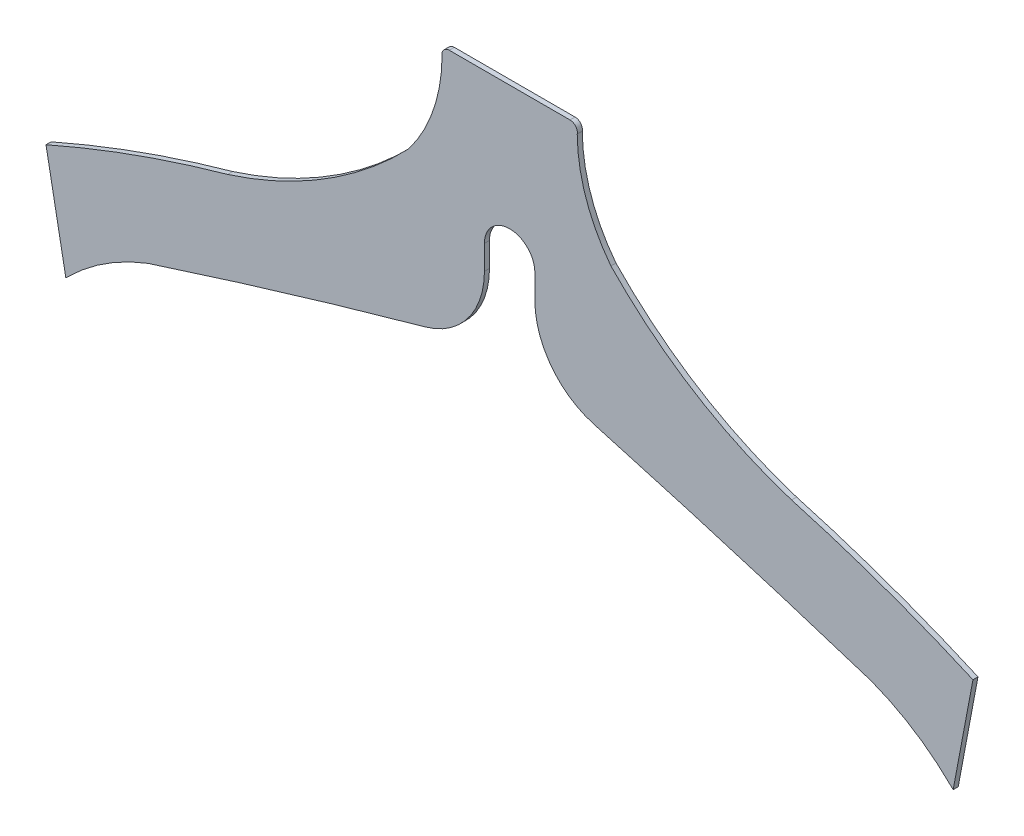
ISO-10303-21;
HEADER;
FILE_DESCRIPTION(('STEP AP214'),'2;1');
FILE_NAME('part.step','',(''),(''),'','','');
FILE_SCHEMA(('AUTOMOTIVE_DESIGN { 1 0 10303 214 1 1 1 1 }'));
ENDSEC;
DATA;
#1=APPLICATION_CONTEXT('core data for automotive mechanical design processes');
#2=APPLICATION_PROTOCOL_DEFINITION('international standard','automotive_design',2000,#1);
#3=PRODUCT_CONTEXT('',#1,'mechanical');
#4=PRODUCT('Part','Part','',(#3));
#5=PRODUCT_RELATED_PRODUCT_CATEGORY('part','',(#4));
#6=PRODUCT_DEFINITION_FORMATION('','',#4);
#7=PRODUCT_DEFINITION_CONTEXT('part definition',#1,'design');
#8=PRODUCT_DEFINITION('design','',#6,#7);
#9=PRODUCT_DEFINITION_SHAPE('','',#8);
#10=(LENGTH_UNIT() NAMED_UNIT(*) SI_UNIT(.MILLI.,.METRE.));
#11=(NAMED_UNIT(*) PLANE_ANGLE_UNIT() SI_UNIT($,.RADIAN.));
#12=(NAMED_UNIT(*) SI_UNIT($,.STERADIAN.) SOLID_ANGLE_UNIT());
#13=UNCERTAINTY_MEASURE_WITH_UNIT(LENGTH_MEASURE(1.E-05),#10,'distance_accuracy_value','');
#14=(GEOMETRIC_REPRESENTATION_CONTEXT(3) GLOBAL_UNCERTAINTY_ASSIGNED_CONTEXT((#13)) GLOBAL_UNIT_ASSIGNED_CONTEXT((#10,
#11,#12)) REPRESENTATION_CONTEXT('',''));
#15=CARTESIAN_POINT('',(0.,0.,0.));
#16=DIRECTION('',(0.,0.,1.));
#17=DIRECTION('',(1.,0.,0.));
#18=AXIS2_PLACEMENT_3D('',#15,#16,#17);
#19=CARTESIAN_POINT('',(-595.807272279208,616.910417452215,0.));
#20=DIRECTION('',(-0.982734564613668,-0.185021013708129,0.));
#21=DIRECTION('',(0.185021013708129,-0.982734564613668,0.));
#22=AXIS2_PLACEMENT_3D('',#19,#20,#21);
#23=PLANE('',#22);
#24=DIRECTION('',(0.185021013708129,-0.982734564613668,0.));
#25=VECTOR('',#24,1.);
#26=CARTESIAN_POINT('',(-168.673710483779,-1651.7989927399,0.));
#27=LINE('',#26,#25);
#28=CARTESIAN_POINT('',(-583.843519435553,553.365238413787,0.));
#29=VERTEX_POINT('',#28);
#30=CARTESIAN_POINT('',(-558.885959893304,420.803774615612,0.));
#31=VERTEX_POINT('',#30);
#32=EDGE_CURVE('E47',#29,#31,#27,.T.);
#33=ORIENTED_EDGE('',*,*,#32,.T.);
#34=DIRECTION('',(0.,0.,-1.));
#35=VECTOR('',#34,1.);
#36=CARTESIAN_POINT('',(-558.885959893304,420.803774615612,6.35));
#37=LINE('',#36,#35);
#38=CARTESIAN_POINT('',(-558.885959893304,420.803774615612,6.35));
#39=VERTEX_POINT('',#38);
#40=EDGE_CURVE('E42',#31,#39,#37,.F.);
#41=ORIENTED_EDGE('',*,*,#40,.T.);
#42=DIRECTION('',(0.185021013708129,-0.982734564613668,0.));
#43=VECTOR('',#42,1.);
#44=CARTESIAN_POINT('',(-168.673710483779,-1651.7989927399,6.35));
#45=LINE('',#44,#43);
#46=CARTESIAN_POINT('',(-583.843519435553,553.365238413787,6.35));
#47=VERTEX_POINT('',#46);
#48=EDGE_CURVE('E352',#47,#39,#45,.T.);
#49=ORIENTED_EDGE('',*,*,#48,.F.);
#50=DIRECTION('',(0.,0.,-1.));
#51=VECTOR('',#50,1.);
#52=CARTESIAN_POINT('',(-583.843519435553,553.365238413787,6.35));
#53=LINE('',#52,#51);
#54=EDGE_CURVE('E349',#47,#29,#53,.T.);
#55=ORIENTED_EDGE('',*,*,#54,.T.);
#56=EDGE_LOOP('',(#33,#41,#49,#55));
#57=FACE_BOUND('',#56,.T.);
#58=ADVANCED_FACE('F38',(#57),#23,.T.);
#59=CARTESIAN_POINT('',(595.807272279208,616.910417452215,0.));
#60=DIRECTION('',(0.982734564613668,-0.185021013708129,0.));
#61=DIRECTION('',(-0.185021013708129,-0.982734564613668,0.));
#62=AXIS2_PLACEMENT_3D('',#59,#60,#61);
#63=PLANE('',#62);
#64=DIRECTION('',(0.185021013708129,0.982734564613668,0.));
#65=VECTOR('',#64,1.);
#66=CARTESIAN_POINT('',(158.629030851378,-1705.15106160708,6.35));
#67=LINE('',#66,#65);
#68=CARTESIAN_POINT('',(558.949095192104,421.139116202677,6.35));
#69=VERTEX_POINT('',#68);
#70=CARTESIAN_POINT('',(583.87829464678,553.549946093092,6.35));
#71=VERTEX_POINT('',#70);
#72=EDGE_CURVE('E200',#69,#71,#67,.T.);
#73=ORIENTED_EDGE('',*,*,#72,.F.);
#74=DIRECTION('',(0.,0.,-1.));
#75=VECTOR('',#74,1.);
#76=CARTESIAN_POINT('',(558.949095192104,421.139116202677,6.35));
#77=LINE('',#76,#75);
#78=CARTESIAN_POINT('',(558.949095192104,421.139116202677,0.));
#79=VERTEX_POINT('',#78);
#80=EDGE_CURVE('E357',#69,#79,#77,.T.);
#81=ORIENTED_EDGE('',*,*,#80,.T.);
#82=DIRECTION('',(0.185021013708129,0.982734564613668,0.));
#83=VECTOR('',#82,1.);
#84=CARTESIAN_POINT('',(158.629030851378,-1705.15106160708,0.));
#85=LINE('',#84,#83);
#86=CARTESIAN_POINT('',(583.87829464678,553.549946093092,0.));
#87=VERTEX_POINT('',#86);
#88=EDGE_CURVE('E11',#79,#87,#85,.T.);
#89=ORIENTED_EDGE('',*,*,#88,.T.);
#90=DIRECTION('',(0.,0.,-1.));
#91=VECTOR('',#90,1.);
#92=CARTESIAN_POINT('',(583.87829464678,553.549946093092,6.35));
#93=LINE('',#92,#91);
#94=EDGE_CURVE('E355',#87,#71,#93,.F.);
#95=ORIENTED_EDGE('',*,*,#94,.T.);
#96=EDGE_LOOP('',(#73,#81,#89,#95));
#97=FACE_BOUND('',#96,.T.);
#98=ADVANCED_FACE('F40',(#97),#63,.T.);
#99=CARTESIAN_POINT('',(-591.806701857498,459.493110976643,6.35));
#100=DIRECTION('',(0.,0.,-1.));
#101=DIRECTION('',(-1.,0.,0.));
#102=AXIS2_PLACEMENT_3D('',#99,#100,#101);
#103=CYLINDRICAL_SURFACE('',#102,50.7999999953742);
#104=ORIENTED_EDGE('',*,*,#40,.F.);
#105=CARTESIAN_POINT('',(-591.806701857498,459.493110976643,0.));
#106=DIRECTION('',(0.,0.,1.));
#107=DIRECTION('',(1.,0.,0.));
#108=AXIS2_PLACEMENT_3D('',#105,#106,#107);
#109=CIRCLE('',#108,50.7999999953742);
#110=CARTESIAN_POINT('',(-556.074212638233,423.384535627771,0.));
#111=VERTEX_POINT('',#110);
#112=EDGE_CURVE('E282',#31,#111,#109,.T.);
#113=ORIENTED_EDGE('',*,*,#112,.T.);
#114=DIRECTION('',(0.,0.,-1.));
#115=VECTOR('',#114,1.);
#116=CARTESIAN_POINT('',(-556.074212638233,423.384535627771,6.35));
#117=LINE('',#116,#115);
#118=CARTESIAN_POINT('',(-556.074212638233,423.384535627771,6.35));
#119=VERTEX_POINT('',#118);
#120=EDGE_CURVE('E330',#119,#111,#117,.T.);
#121=ORIENTED_EDGE('',*,*,#120,.F.);
#122=CARTESIAN_POINT('',(-591.806701857498,459.493110976643,6.35));
#123=DIRECTION('',(0.,0.,1.));
#124=DIRECTION('',(1.,0.,0.));
#125=AXIS2_PLACEMENT_3D('',#122,#123,#124);
#126=CIRCLE('',#125,50.7999999953742);
#127=EDGE_CURVE('E232',#39,#119,#126,.T.);
#128=ORIENTED_EDGE('',*,*,#127,.F.);
#129=EDGE_LOOP('',(#104,#113,#121,#128));
#130=FACE_BOUND('',#129,.T.);
#131=ADVANCED_FACE('F370',(#130),#103,.T.);
#132=CARTESIAN_POINT('',(-352.772079201171,217.942637673702,6.35));
#133=DIRECTION('',(0.,0.,-1.));
#134=DIRECTION('',(-1.,0.,0.));
#135=AXIS2_PLACEMENT_3D('',#132,#133,#134);
#136=CYLINDRICAL_SURFACE('',#135,289.029636707088);
#137=CARTESIAN_POINT('',(-352.772079201171,217.942637673702,0.));
#138=DIRECTION('',(0.,0.,1.));
#139=DIRECTION('',(1.,0.,0.));
#140=AXIS2_PLACEMENT_3D('',#137,#138,#139);
#141=CIRCLE('',#140,289.029636707088);
#142=CARTESIAN_POINT('',(-455.131011212075,488.240214304752,0.));
#143=VERTEX_POINT('',#142);
#144=EDGE_CURVE('E284',#143,#111,#141,.T.);
#145=ORIENTED_EDGE('',*,*,#144,.F.);
#146=DIRECTION('',(0.,0.,-1.));
#147=VECTOR('',#146,1.);
#148=CARTESIAN_POINT('',(-455.131011212075,488.240214304752,6.35));
#149=LINE('',#148,#147);
#150=CARTESIAN_POINT('',(-455.131011212075,488.240214304752,6.35));
#151=VERTEX_POINT('',#150);
#152=EDGE_CURVE('E328',#151,#143,#149,.T.);
#153=ORIENTED_EDGE('',*,*,#152,.F.);
#154=CARTESIAN_POINT('',(-352.772079201171,217.942637673702,6.35));
#155=DIRECTION('',(0.,0.,1.));
#156=DIRECTION('',(1.,0.,0.));
#157=AXIS2_PLACEMENT_3D('',#154,#155,#156);
#158=CIRCLE('',#157,289.029636707088);
#159=EDGE_CURVE('E234',#151,#119,#158,.T.);
#160=ORIENTED_EDGE('',*,*,#159,.T.);
#161=ORIENTED_EDGE('',*,*,#120,.T.);
#162=EDGE_LOOP('',(#145,#153,#160,#161));
#163=FACE_BOUND('',#162,.T.);
#164=ADVANCED_FACE('F413',(#163),#136,.F.);
#165=CARTESIAN_POINT('',(2211.66508660862,-7725.16942473213,6.35));
#166=DIRECTION('',(0.,0.,-1.));
#167=DIRECTION('',(-1.,0.,0.));
#168=AXIS2_PLACEMENT_3D('',#165,#166,#167);
#169=CYLINDRICAL_SURFACE('',#168,8635.50226251928);
#170=CARTESIAN_POINT('',(2211.66508660862,-7725.16942473213,0.));
#171=DIRECTION('',(0.,0.,1.));
#172=DIRECTION('',(1.,0.,0.));
#173=AXIS2_PLACEMENT_3D('',#170,#171,#172);
#174=CIRCLE('',#173,8635.50226251928);
#175=CARTESIAN_POINT('',(-105.856855128073,593.543899787754,0.));
#176=VERTEX_POINT('',#175);
#177=EDGE_CURVE('E287',#176,#143,#174,.T.);
#178=ORIENTED_EDGE('',*,*,#177,.F.);
#179=DIRECTION('',(0.,0.,-1.));
#180=VECTOR('',#179,1.);
#181=CARTESIAN_POINT('',(-105.856855128073,593.543899787754,6.35));
#182=LINE('',#181,#180);
#183=CARTESIAN_POINT('',(-105.856855128073,593.543899787754,6.35));
#184=VERTEX_POINT('',#183);
#185=EDGE_CURVE('E326',#184,#176,#182,.T.);
#186=ORIENTED_EDGE('',*,*,#185,.F.);
#187=CARTESIAN_POINT('',(2211.66508660862,-7725.16942473213,6.35));
#188=DIRECTION('',(0.,0.,1.));
#189=DIRECTION('',(1.,0.,0.));
#190=AXIS2_PLACEMENT_3D('',#187,#188,#189);
#191=CIRCLE('',#190,8635.50226251928);
#192=EDGE_CURVE('E237',#184,#151,#191,.T.);
#193=ORIENTED_EDGE('',*,*,#192,.T.);
#194=ORIENTED_EDGE('',*,*,#152,.T.);
#195=EDGE_LOOP('',(#178,#186,#193,#194));
#196=FACE_BOUND('',#195,.T.);
#197=ADVANCED_FACE('F449',(#196),#169,.F.);
#198=CARTESIAN_POINT('',(-133.123390666307,691.416756289343,6.35));
#199=DIRECTION('',(0.,0.,-1.));
#200=DIRECTION('',(-1.,0.,0.));
#201=AXIS2_PLACEMENT_3D('',#198,#199,#200);
#202=CYLINDRICAL_SURFACE('',#201,101.600000000191);
#203=CARTESIAN_POINT('',(-133.123390666307,691.416756289343,0.));
#204=DIRECTION('',(0.,0.,1.));
#205=DIRECTION('',(1.,0.,0.));
#206=AXIS2_PLACEMENT_3D('',#203,#204,#205);
#207=CIRCLE('',#206,101.600000000191);
#208=CARTESIAN_POINT('',(-31.5233906661163,691.416756289345,0.));
#209=VERTEX_POINT('',#208);
#210=EDGE_CURVE('E290',#176,#209,#207,.T.);
#211=ORIENTED_EDGE('',*,*,#210,.T.);
#212=DIRECTION('',(0.,0.,-1.));
#213=VECTOR('',#212,1.);
#214=CARTESIAN_POINT('',(-31.5233906661163,691.416756289345,6.35));
#215=LINE('',#214,#213);
#216=CARTESIAN_POINT('',(-31.5233906661163,691.416756289345,6.35));
#217=VERTEX_POINT('',#216);
#218=EDGE_CURVE('E324',#217,#209,#215,.T.);
#219=ORIENTED_EDGE('',*,*,#218,.F.);
#220=CARTESIAN_POINT('',(-133.123390666307,691.416756289343,6.35));
#221=DIRECTION('',(0.,0.,1.));
#222=DIRECTION('',(1.,0.,0.));
#223=AXIS2_PLACEMENT_3D('',#220,#221,#222);
#224=CIRCLE('',#223,101.600000000191);
#225=EDGE_CURVE('E240',#184,#217,#224,.T.);
#226=ORIENTED_EDGE('',*,*,#225,.F.);
#227=ORIENTED_EDGE('',*,*,#185,.T.);
#228=EDGE_LOOP('',(#211,#219,#226,#227));
#229=FACE_BOUND('',#228,.T.);
#230=ADVANCED_FACE('F457',(#229),#202,.T.);
#231=CARTESIAN_POINT('',(-31.5233906661503,-1647.66412096756,6.35));
#232=DIRECTION('',(1.,0.,0.));
#233=DIRECTION('',(0.,1.,0.));
#234=AXIS2_PLACEMENT_3D('',#231,#232,#233);
#235=PLANE('',#234);
#236=DIRECTION('',(0.,-1.,0.));
#237=VECTOR('',#236,1.);
#238=CARTESIAN_POINT('',(-31.5233906661503,-1647.66412096756,0.));
#239=LINE('',#238,#237);
#240=CARTESIAN_POINT('',(-31.5233906661159,721.9730320689,0.));
#241=VERTEX_POINT('',#240);
#242=EDGE_CURVE('E293',#241,#209,#239,.T.);
#243=ORIENTED_EDGE('',*,*,#242,.F.);
#244=DIRECTION('',(0.,0.,-1.));
#245=VECTOR('',#244,1.);
#246=CARTESIAN_POINT('',(-31.5233906661159,721.9730320689,6.35));
#247=LINE('',#246,#245);
#248=CARTESIAN_POINT('',(-31.5233906661159,721.9730320689,6.35));
#249=VERTEX_POINT('',#248);
#250=EDGE_CURVE('E322',#249,#241,#247,.T.);
#251=ORIENTED_EDGE('',*,*,#250,.F.);
#252=DIRECTION('',(0.,-1.,0.));
#253=VECTOR('',#252,1.);
#254=CARTESIAN_POINT('',(-31.5233906661503,-1647.66412096756,6.35));
#255=LINE('',#254,#253);
#256=EDGE_CURVE('E242',#249,#217,#255,.T.);
#257=ORIENTED_EDGE('',*,*,#256,.T.);
#258=ORIENTED_EDGE('',*,*,#218,.T.);
#259=EDGE_LOOP('',(#243,#251,#257,#258));
#260=FACE_BOUND('',#259,.T.);
#261=ADVANCED_FACE('F443',(#260),#235,.T.);
#262=CARTESIAN_POINT('',(0.226609334128103,721.973032068901,6.35));
#263=DIRECTION('',(0.,0.,-1.));
#264=DIRECTION('',(-1.,0.,0.));
#265=AXIS2_PLACEMENT_3D('',#262,#263,#264);
#266=CYLINDRICAL_SURFACE('',#265,31.750000000244);
#267=CARTESIAN_POINT('',(0.226609334128103,721.973032068901,0.));
#268=DIRECTION('',(0.,0.,1.));
#269=DIRECTION('',(1.,0.,0.));
#270=AXIS2_PLACEMENT_3D('',#267,#268,#269);
#271=CIRCLE('',#270,31.750000000244);
#272=CARTESIAN_POINT('',(31.9766093343712,721.9730320689,0.));
#273=VERTEX_POINT('',#272);
#274=EDGE_CURVE('E296',#273,#241,#271,.T.);
#275=ORIENTED_EDGE('',*,*,#274,.F.);
#276=DIRECTION('',(0.,0.,-1.));
#277=VECTOR('',#276,1.);
#278=CARTESIAN_POINT('',(31.9766093343712,721.9730320689,6.35));
#279=LINE('',#278,#277);
#280=CARTESIAN_POINT('',(31.9766093343712,721.9730320689,6.35));
#281=VERTEX_POINT('',#280);
#282=EDGE_CURVE('E320',#281,#273,#279,.T.);
#283=ORIENTED_EDGE('',*,*,#282,.F.);
#284=CARTESIAN_POINT('',(0.226609334128103,721.973032068901,6.35));
#285=DIRECTION('',(0.,0.,1.));
#286=DIRECTION('',(1.,0.,0.));
#287=AXIS2_PLACEMENT_3D('',#284,#285,#286);
#288=CIRCLE('',#287,31.750000000244);
#289=EDGE_CURVE('E245',#281,#249,#288,.T.);
#290=ORIENTED_EDGE('',*,*,#289,.T.);
#291=ORIENTED_EDGE('',*,*,#250,.T.);
#292=EDGE_LOOP('',(#275,#283,#290,#291));
#293=FACE_BOUND('',#292,.T.);
#294=ADVANCED_FACE('F438',(#293),#266,.F.);
#295=CARTESIAN_POINT('',(31.9766093343367,-1647.66412096756,6.35));
#296=DIRECTION('',(1.,0.,0.));
#297=DIRECTION('',(0.,1.,0.));
#298=AXIS2_PLACEMENT_3D('',#295,#296,#297);
#299=PLANE('',#298);
#300=DIRECTION('',(0.,-1.,0.));
#301=VECTOR('',#300,1.);
#302=CARTESIAN_POINT('',(31.9766093343367,-1647.66412096756,0.));
#303=LINE('',#302,#301);
#304=CARTESIAN_POINT('',(31.9766093343707,691.416756289345,0.));
#305=VERTEX_POINT('',#304);
#306=EDGE_CURVE('E299',#273,#305,#303,.T.);
#307=ORIENTED_EDGE('',*,*,#306,.T.);
#308=DIRECTION('',(0.,0.,-1.));
#309=VECTOR('',#308,1.);
#310=CARTESIAN_POINT('',(31.9766093343707,691.416756289345,6.35));
#311=LINE('',#310,#309);
#312=CARTESIAN_POINT('',(31.9766093343707,691.416756289345,6.35));
#313=VERTEX_POINT('',#312);
#314=EDGE_CURVE('E317',#313,#305,#311,.T.);
#315=ORIENTED_EDGE('',*,*,#314,.F.);
#316=DIRECTION('',(0.,-1.,0.));
#317=VECTOR('',#316,1.);
#318=CARTESIAN_POINT('',(31.9766093343367,-1647.66412096756,6.35));
#319=LINE('',#318,#317);
#320=EDGE_CURVE('E248',#281,#313,#319,.T.);
#321=ORIENTED_EDGE('',*,*,#320,.F.);
#322=ORIENTED_EDGE('',*,*,#282,.T.);
#323=EDGE_LOOP('',(#307,#315,#321,#322));
#324=FACE_BOUND('',#323,.T.);
#325=ADVANCED_FACE('F435',(#324),#299,.F.);
#326=CARTESIAN_POINT('',(133.576609334561,691.416756289343,6.35));
#327=DIRECTION('',(0.,0.,-1.));
#328=DIRECTION('',(-1.,0.,0.));
#329=AXIS2_PLACEMENT_3D('',#326,#327,#328);
#330=CYLINDRICAL_SURFACE('',#329,101.600000000189);
#331=CARTESIAN_POINT('',(133.576609334561,691.416756289343,0.));
#332=DIRECTION('',(0.,0.,1.));
#333=DIRECTION('',(1.,0.,0.));
#334=AXIS2_PLACEMENT_3D('',#331,#332,#333);
#335=CIRCLE('',#334,101.600000000189);
#336=CARTESIAN_POINT('',(106.310073796315,593.543899787756,0.));
#337=VERTEX_POINT('',#336);
#338=EDGE_CURVE('E302',#305,#337,#335,.T.);
#339=ORIENTED_EDGE('',*,*,#338,.T.);
#340=DIRECTION('',(0.,0.,-1.));
#341=VECTOR('',#340,1.);
#342=CARTESIAN_POINT('',(106.310073796315,593.543899787756,6.35));
#343=LINE('',#342,#341);
#344=CARTESIAN_POINT('',(106.310073796315,593.543899787756,6.35));
#345=VERTEX_POINT('',#344);
#346=EDGE_CURVE('E315',#345,#337,#343,.T.);
#347=ORIENTED_EDGE('',*,*,#346,.F.);
#348=CARTESIAN_POINT('',(133.576609334561,691.416756289343,6.35));
#349=DIRECTION('',(0.,0.,1.));
#350=DIRECTION('',(1.,0.,0.));
#351=AXIS2_PLACEMENT_3D('',#348,#349,#350);
#352=CIRCLE('',#351,101.600000000189);
#353=EDGE_CURVE('E251',#313,#345,#352,.T.);
#354=ORIENTED_EDGE('',*,*,#353,.F.);
#355=ORIENTED_EDGE('',*,*,#314,.T.);
#356=EDGE_LOOP('',(#339,#347,#354,#355));
#357=FACE_BOUND('',#356,.T.);
#358=ADVANCED_FACE('F431',(#357),#330,.T.);
#359=CARTESIAN_POINT('',(-2211.21186794037,-7725.16942473213,6.35));
#360=DIRECTION('',(0.,0.,-1.));
#361=DIRECTION('',(-1.,0.,0.));
#362=AXIS2_PLACEMENT_3D('',#359,#360,#361);
#363=CYLINDRICAL_SURFACE('',#362,8635.50226251928);
#364=CARTESIAN_POINT('',(-2211.21186794037,-7725.16942473213,0.));
#365=DIRECTION('',(0.,0.,1.));
#366=DIRECTION('',(1.,0.,0.));
#367=AXIS2_PLACEMENT_3D('',#364,#365,#366);
#368=CIRCLE('',#367,8635.50226251928);
#369=CARTESIAN_POINT('',(455.584229880328,488.240214304751,0.));
#370=VERTEX_POINT('',#369);
#371=EDGE_CURVE('E305',#370,#337,#368,.T.);
#372=ORIENTED_EDGE('',*,*,#371,.F.);
#373=DIRECTION('',(0.,0.,-1.));
#374=VECTOR('',#373,1.);
#375=CARTESIAN_POINT('',(455.584229880328,488.240214304751,6.35));
#376=LINE('',#375,#374);
#377=CARTESIAN_POINT('',(455.584229880328,488.240214304751,6.35));
#378=VERTEX_POINT('',#377);
#379=EDGE_CURVE('E313',#378,#370,#376,.T.);
#380=ORIENTED_EDGE('',*,*,#379,.F.);
#381=CARTESIAN_POINT('',(-2211.21186794037,-7725.16942473213,6.35));
#382=DIRECTION('',(0.,0.,1.));
#383=DIRECTION('',(1.,0.,0.));
#384=AXIS2_PLACEMENT_3D('',#381,#382,#383);
#385=CIRCLE('',#384,8635.50226251928);
#386=EDGE_CURVE('E253',#378,#345,#385,.T.);
#387=ORIENTED_EDGE('',*,*,#386,.T.);
#388=ORIENTED_EDGE('',*,*,#346,.T.);
#389=EDGE_LOOP('',(#372,#380,#387,#388));
#390=FACE_BOUND('',#389,.T.);
#391=ADVANCED_FACE('F428',(#390),#363,.F.);
#392=CARTESIAN_POINT('',(353.225297869425,217.942637673702,6.35));
#393=DIRECTION('',(0.,0.,-1.));
#394=DIRECTION('',(-1.,0.,0.));
#395=AXIS2_PLACEMENT_3D('',#392,#393,#394);
#396=CYLINDRICAL_SURFACE('',#395,289.029636707086);
#397=CARTESIAN_POINT('',(353.225297869425,217.942637673702,0.));
#398=DIRECTION('',(0.,0.,1.));
#399=DIRECTION('',(1.,0.,0.));
#400=AXIS2_PLACEMENT_3D('',#397,#398,#399);
#401=CIRCLE('',#400,289.029636707086);
#402=CARTESIAN_POINT('',(556.527431306354,423.384535627901,0.));
#403=VERTEX_POINT('',#402);
#404=EDGE_CURVE('E308',#403,#370,#401,.T.);
#405=ORIENTED_EDGE('',*,*,#404,.F.);
#406=DIRECTION('',(0.,0.,-1.));
#407=VECTOR('',#406,1.);
#408=CARTESIAN_POINT('',(556.527431306354,423.384535627901,6.35));
#409=LINE('',#408,#407);
#410=CARTESIAN_POINT('',(556.527431306354,423.384535627901,6.35));
#411=VERTEX_POINT('',#410);
#412=EDGE_CURVE('E210',#411,#403,#409,.T.);
#413=ORIENTED_EDGE('',*,*,#412,.F.);
#414=CARTESIAN_POINT('',(353.225297869425,217.942637673702,6.35));
#415=DIRECTION('',(0.,0.,1.));
#416=DIRECTION('',(1.,0.,0.));
#417=AXIS2_PLACEMENT_3D('',#414,#415,#416);
#418=CIRCLE('',#417,289.029636707086);
#419=EDGE_CURVE('E256',#411,#378,#418,.T.);
#420=ORIENTED_EDGE('',*,*,#419,.T.);
#421=ORIENTED_EDGE('',*,*,#379,.T.);
#422=EDGE_LOOP('',(#405,#413,#420,#421));
#423=FACE_BOUND('',#422,.T.);
#424=ADVANCED_FACE('F424',(#423),#396,.F.);
#425=CARTESIAN_POINT('',(592.259920525752,459.493110976643,6.35));
#426=DIRECTION('',(0.,0.,-1.));
#427=DIRECTION('',(-1.,0.,0.));
#428=AXIS2_PLACEMENT_3D('',#425,#426,#427);
#429=CYLINDRICAL_SURFACE('',#428,50.7999999953761);
#430=ORIENTED_EDGE('',*,*,#80,.F.);
#431=CARTESIAN_POINT('',(592.259920525752,459.493110976643,6.35));
#432=DIRECTION('',(0.,0.,1.));
#433=DIRECTION('',(1.,0.,0.));
#434=AXIS2_PLACEMENT_3D('',#431,#432,#433);
#435=CIRCLE('',#434,50.7999999953761);
#436=EDGE_CURVE('E259',#411,#69,#435,.T.);
#437=ORIENTED_EDGE('',*,*,#436,.F.);
#438=ORIENTED_EDGE('',*,*,#412,.T.);
#439=CARTESIAN_POINT('',(592.259920525752,459.493110976643,0.));
#440=DIRECTION('',(0.,0.,1.));
#441=DIRECTION('',(1.,0.,0.));
#442=AXIS2_PLACEMENT_3D('',#439,#440,#441);
#443=CIRCLE('',#442,50.7999999953761);
#444=EDGE_CURVE('E203',#403,#79,#443,.T.);
#445=ORIENTED_EDGE('',*,*,#444,.T.);
#446=EDGE_LOOP('',(#430,#437,#438,#445));
#447=FACE_BOUND('',#446,.T.);
#448=ADVANCED_FACE('F418',(#447),#429,.T.);
#449=CARTESIAN_POINT('',(-100.86049503032,-998.248317486912,6.35));
#450=DIRECTION('',(0.,0.,-1.));
#451=DIRECTION('',(-1.,0.,0.));
#452=AXIS2_PLACEMENT_3D('',#449,#450,#451);
#453=CYLINDRICAL_SURFACE('',#452,1696.1559659826);
#454=ORIENTED_EDGE('',*,*,#94,.F.);
#455=CARTESIAN_POINT('',(-100.86049503032,-998.248317486912,0.));
#456=DIRECTION('',(0.,0.,1.));
#457=DIRECTION('',(1.,0.,0.));
#458=AXIS2_PLACEMENT_3D('',#455,#456,#457);
#459=CIRCLE('',#458,1696.1559659826);
#460=CARTESIAN_POINT('',(355.393609918761,635.39094889214,0.));
#461=VERTEX_POINT('',#460);
#462=EDGE_CURVE('E63',#87,#461,#459,.T.);
#463=ORIENTED_EDGE('',*,*,#462,.T.);
#464=DIRECTION('',(0.,0.,-1.));
#465=VECTOR('',#464,1.);
#466=CARTESIAN_POINT('',(355.393609918761,635.39094889214,6.35));
#467=LINE('',#466,#465);
#468=CARTESIAN_POINT('',(355.393609918761,635.39094889214,6.35));
#469=VERTEX_POINT('',#468);
#470=EDGE_CURVE('E206',#469,#461,#467,.T.);
#471=ORIENTED_EDGE('',*,*,#470,.F.);
#472=CARTESIAN_POINT('',(-100.86049503032,-998.248317486912,6.35));
#473=DIRECTION('',(0.,0.,1.));
#474=DIRECTION('',(1.,0.,0.));
#475=AXIS2_PLACEMENT_3D('',#472,#473,#474);
#476=CIRCLE('',#475,1696.1559659826);
#477=EDGE_CURVE('E191',#71,#469,#476,.T.);
#478=ORIENTED_EDGE('',*,*,#477,.F.);
#479=EDGE_LOOP('',(#454,#463,#471,#478));
#480=FACE_BOUND('',#479,.T.);
#481=ADVANCED_FACE('F207',(#480),#453,.T.);
#482=CARTESIAN_POINT('',(519.610281776178,1153.24142300968,6.35));
#483=DIRECTION('',(0.,0.,-1.));
#484=DIRECTION('',(-1.,0.,0.));
#485=AXIS2_PLACEMENT_3D('',#482,#483,#484);
#486=CYLINDRICAL_SURFACE('',#485,543.264418915587);
#487=CARTESIAN_POINT('',(519.610281776178,1153.24142300968,0.));
#488=DIRECTION('',(0.,0.,1.));
#489=DIRECTION('',(1.,0.,0.));
#490=AXIS2_PLACEMENT_3D('',#487,#488,#489);
#491=CIRCLE('',#490,543.264418915587);
#492=CARTESIAN_POINT('',(127.821938495965,776.893016703191,0.));
#493=VERTEX_POINT('',#492);
#494=EDGE_CURVE('E263',#493,#461,#491,.T.);
#495=ORIENTED_EDGE('',*,*,#494,.F.);
#496=DIRECTION('',(0.,0.,-1.));
#497=VECTOR('',#496,1.);
#498=CARTESIAN_POINT('',(127.821938495965,776.893016703191,6.35));
#499=LINE('',#498,#497);
#500=CARTESIAN_POINT('',(127.821938495965,776.893016703191,6.35));
#501=VERTEX_POINT('',#500);
#502=EDGE_CURVE('E211',#501,#493,#499,.T.);
#503=ORIENTED_EDGE('',*,*,#502,.F.);
#504=CARTESIAN_POINT('',(519.610281776178,1153.24142300968,6.35));
#505=DIRECTION('',(0.,0.,1.));
#506=DIRECTION('',(1.,0.,0.));
#507=AXIS2_PLACEMENT_3D('',#504,#505,#506);
#508=CIRCLE('',#507,543.264418915587);
#509=EDGE_CURVE('E197',#501,#469,#508,.T.);
#510=ORIENTED_EDGE('',*,*,#509,.T.);
#511=ORIENTED_EDGE('',*,*,#470,.T.);
#512=EDGE_LOOP('',(#495,#503,#510,#511));
#513=FACE_BOUND('',#512,.T.);
#514=ADVANCED_FACE('F213',(#513),#486,.F.);
#515=CARTESIAN_POINT('',(287.706833519392,900.937313434264,6.35));
#516=DIRECTION('',(0.,0.,-1.));
#517=DIRECTION('',(-1.,0.,0.));
#518=AXIS2_PLACEMENT_3D('',#515,#516,#517);
#519=CYLINDRICAL_SURFACE('',#518,202.36147659117);
#520=CARTESIAN_POINT('',(287.706833519392,900.937313434264,0.));
#521=DIRECTION('',(0.,0.,1.));
#522=DIRECTION('',(1.,0.,0.));
#523=AXIS2_PLACEMENT_3D('',#520,#521,#522);
#524=CIRCLE('',#523,202.36147659117);
#525=CARTESIAN_POINT('',(85.3501593560324,899.543172228003,0.));
#526=VERTEX_POINT('',#525);
#527=EDGE_CURVE('E265',#526,#493,#524,.T.);
#528=ORIENTED_EDGE('',*,*,#527,.F.);
#529=DIRECTION('',(0.,0.,-1.));
#530=VECTOR('',#529,1.);
#531=CARTESIAN_POINT('',(85.3501593560324,899.543172228003,6.35));
#532=LINE('',#531,#530);
#533=CARTESIAN_POINT('',(85.3501593560324,899.543172228003,6.35));
#534=VERTEX_POINT('',#533);
#535=EDGE_CURVE('E344',#534,#526,#532,.T.);
#536=ORIENTED_EDGE('',*,*,#535,.F.);
#537=CARTESIAN_POINT('',(287.706833519392,900.937313434264,6.35));
#538=DIRECTION('',(0.,0.,1.));
#539=DIRECTION('',(1.,0.,0.));
#540=AXIS2_PLACEMENT_3D('',#537,#538,#539);
#541=CIRCLE('',#540,202.36147659117);
#542=EDGE_CURVE('E214',#534,#501,#541,.T.);
#543=ORIENTED_EDGE('',*,*,#542,.T.);
#544=ORIENTED_EDGE('',*,*,#502,.T.);
#545=EDGE_LOOP('',(#528,#536,#543,#544));
#546=FACE_BOUND('',#545,.T.);
#547=ADVANCED_FACE('F396',(#546),#519,.F.);
#548=CARTESIAN_POINT('',(76.2924143642922,901.243462618615,6.35));
#549=DIRECTION('',(0.,0.,-1.));
#550=DIRECTION('',(-1.,0.,0.));
#551=AXIS2_PLACEMENT_3D('',#548,#549,#550);
#552=CYLINDRICAL_SURFACE('',#551,9.21594985597272);
#553=CARTESIAN_POINT('',(76.2924143642922,901.243462618615,0.));
#554=DIRECTION('',(0.,0.,1.));
#555=DIRECTION('',(1.,0.,0.));
#556=AXIS2_PLACEMENT_3D('',#553,#554,#555);
#557=CIRCLE('',#556,9.21594985597272);
#558=CARTESIAN_POINT('',(76.2924143642913,910.459412474588,0.));
#559=VERTEX_POINT('',#558);
#560=EDGE_CURVE('E268',#526,#559,#557,.T.);
#561=ORIENTED_EDGE('',*,*,#560,.T.);
#562=DIRECTION('',(0.,0.,-1.));
#563=VECTOR('',#562,1.);
#564=CARTESIAN_POINT('',(76.2924143642913,910.459412474588,6.35));
#565=LINE('',#564,#563);
#566=CARTESIAN_POINT('',(76.2924143642913,910.459412474588,6.35));
#567=VERTEX_POINT('',#566);
#568=EDGE_CURVE('E341',#567,#559,#565,.T.);
#569=ORIENTED_EDGE('',*,*,#568,.F.);
#570=CARTESIAN_POINT('',(76.2924143642922,901.243462618615,6.35));
#571=DIRECTION('',(0.,0.,1.));
#572=DIRECTION('',(1.,0.,0.));
#573=AXIS2_PLACEMENT_3D('',#570,#571,#572);
#574=CIRCLE('',#573,9.21594985597272);
#575=EDGE_CURVE('E216',#534,#567,#574,.T.);
#576=ORIENTED_EDGE('',*,*,#575,.F.);
#577=ORIENTED_EDGE('',*,*,#535,.T.);
#578=EDGE_LOOP('',(#561,#569,#576,#577));
#579=FACE_BOUND('',#578,.T.);
#580=ADVANCED_FACE('F398',(#579),#552,.T.);
#581=CARTESIAN_POINT('',(-146.711440742175,910.459412474585,6.35));
#582=DIRECTION('',(0.,-1.,0.));
#583=DIRECTION('',(1.,0.,0.));
#584=AXIS2_PLACEMENT_3D('',#581,#582,#583);
#585=PLANE('',#584);
#586=DIRECTION('',(-1.,0.,0.));
#587=VECTOR('',#586,1.);
#588=CARTESIAN_POINT('',(-146.711440742175,910.459412474585,0.));
#589=LINE('',#588,#587);
#590=CARTESIAN_POINT('',(-75.8391957197495,910.459412474588,0.));
#591=VERTEX_POINT('',#590);
#592=EDGE_CURVE('E270',#559,#591,#589,.T.);
#593=ORIENTED_EDGE('',*,*,#592,.T.);
#594=DIRECTION('',(0.,0.,-1.));
#595=VECTOR('',#594,1.);
#596=CARTESIAN_POINT('',(-75.8391957197495,910.459412474588,6.35));
#597=LINE('',#596,#595);
#598=CARTESIAN_POINT('',(-75.8391957197495,910.459412474588,6.35));
#599=VERTEX_POINT('',#598);
#600=EDGE_CURVE('E338',#599,#591,#597,.T.);
#601=ORIENTED_EDGE('',*,*,#600,.F.);
#602=DIRECTION('',(-1.,0.,0.));
#603=VECTOR('',#602,1.);
#604=CARTESIAN_POINT('',(-146.711440742175,910.459412474585,6.35));
#605=LINE('',#604,#603);
#606=EDGE_CURVE('E220',#567,#599,#605,.T.);
#607=ORIENTED_EDGE('',*,*,#606,.F.);
#608=ORIENTED_EDGE('',*,*,#568,.T.);
#609=EDGE_LOOP('',(#593,#601,#607,#608));
#610=FACE_BOUND('',#609,.T.);
#611=ADVANCED_FACE('F390',(#610),#585,.F.);
#612=CARTESIAN_POINT('',(-75.8391957197504,901.243462618615,6.35));
#613=DIRECTION('',(0.,0.,-1.));
#614=DIRECTION('',(-1.,0.,0.));
#615=AXIS2_PLACEMENT_3D('',#612,#613,#614);
#616=CYLINDRICAL_SURFACE('',#615,9.21594985597198);
#617=CARTESIAN_POINT('',(-75.8391957197504,901.243462618615,0.));
#618=DIRECTION('',(0.,0.,1.));
#619=DIRECTION('',(1.,0.,0.));
#620=AXIS2_PLACEMENT_3D('',#617,#618,#619);
#621=CIRCLE('',#620,9.21594985597198);
#622=CARTESIAN_POINT('',(-84.89694071149,899.543172228004,0.));
#623=VERTEX_POINT('',#622);
#624=EDGE_CURVE('E272',#591,#623,#621,.T.);
#625=ORIENTED_EDGE('',*,*,#624,.T.);
#626=DIRECTION('',(0.,0.,-1.));
#627=VECTOR('',#626,1.);
#628=CARTESIAN_POINT('',(-84.89694071149,899.543172228004,6.35));
#629=LINE('',#628,#627);
#630=CARTESIAN_POINT('',(-84.89694071149,899.543172228004,6.35));
#631=VERTEX_POINT('',#630);
#632=EDGE_CURVE('E336',#631,#623,#629,.T.);
#633=ORIENTED_EDGE('',*,*,#632,.F.);
#634=CARTESIAN_POINT('',(-75.8391957197504,901.243462618615,6.35));
#635=DIRECTION('',(0.,0.,1.));
#636=DIRECTION('',(1.,0.,0.));
#637=AXIS2_PLACEMENT_3D('',#634,#635,#636);
#638=CIRCLE('',#637,9.21594985597198);
#639=EDGE_CURVE('E222',#599,#631,#638,.T.);
#640=ORIENTED_EDGE('',*,*,#639,.F.);
#641=ORIENTED_EDGE('',*,*,#600,.T.);
#642=EDGE_LOOP('',(#625,#633,#640,#641));
#643=FACE_BOUND('',#642,.T.);
#644=ADVANCED_FACE('F386',(#643),#616,.T.);
#645=CARTESIAN_POINT('',(-287.25361487485,900.937313434264,6.35));
#646=DIRECTION('',(0.,0.,-1.));
#647=DIRECTION('',(-1.,0.,0.));
#648=AXIS2_PLACEMENT_3D('',#645,#646,#647);
#649=CYLINDRICAL_SURFACE('',#648,202.361476591172);
#650=CARTESIAN_POINT('',(-287.25361487485,900.937313434264,0.));
#651=DIRECTION('',(0.,0.,1.));
#652=DIRECTION('',(1.,0.,0.));
#653=AXIS2_PLACEMENT_3D('',#650,#651,#652);
#654=CIRCLE('',#653,202.361476591172);
#655=CARTESIAN_POINT('',(-127.368719851511,776.893016703075,0.));
#656=VERTEX_POINT('',#655);
#657=EDGE_CURVE('E275',#656,#623,#654,.T.);
#658=ORIENTED_EDGE('',*,*,#657,.F.);
#659=DIRECTION('',(0.,0.,-1.));
#660=VECTOR('',#659,1.);
#661=CARTESIAN_POINT('',(-127.368719851511,776.893016703075,6.35));
#662=LINE('',#661,#660);
#663=CARTESIAN_POINT('',(-127.368719851511,776.893016703075,6.35));
#664=VERTEX_POINT('',#663);
#665=EDGE_CURVE('E334',#664,#656,#662,.T.);
#666=ORIENTED_EDGE('',*,*,#665,.F.);
#667=CARTESIAN_POINT('',(-287.25361487485,900.937313434264,6.35));
#668=DIRECTION('',(0.,0.,1.));
#669=DIRECTION('',(1.,0.,0.));
#670=AXIS2_PLACEMENT_3D('',#667,#668,#669);
#671=CIRCLE('',#670,202.361476591172);
#672=EDGE_CURVE('E224',#664,#631,#671,.T.);
#673=ORIENTED_EDGE('',*,*,#672,.T.);
#674=ORIENTED_EDGE('',*,*,#632,.T.);
#675=EDGE_LOOP('',(#658,#666,#673,#674));
#676=FACE_BOUND('',#675,.T.);
#677=ADVANCED_FACE('F382',(#676),#649,.F.);
#678=CARTESIAN_POINT('',(-519.157063131618,1153.24142300967,6.35));
#679=DIRECTION('',(0.,0.,-1.));
#680=DIRECTION('',(-1.,0.,0.));
#681=AXIS2_PLACEMENT_3D('',#678,#679,#680);
#682=CYLINDRICAL_SURFACE('',#681,543.264418915578);
#683=CARTESIAN_POINT('',(-519.157063131618,1153.24142300967,0.));
#684=DIRECTION('',(0.,0.,1.));
#685=DIRECTION('',(1.,0.,0.));
#686=AXIS2_PLACEMENT_3D('',#683,#684,#685);
#687=CIRCLE('',#686,543.264418915578);
#688=CARTESIAN_POINT('',(-354.9403912742,635.390948892134,0.));
#689=VERTEX_POINT('',#688);
#690=EDGE_CURVE('E278',#689,#656,#687,.T.);
#691=ORIENTED_EDGE('',*,*,#690,.F.);
#692=DIRECTION('',(0.,0.,-1.));
#693=VECTOR('',#692,1.);
#694=CARTESIAN_POINT('',(-354.9403912742,635.390948892134,6.35));
#695=LINE('',#694,#693);
#696=CARTESIAN_POINT('',(-354.9403912742,635.390948892134,6.35));
#697=VERTEX_POINT('',#696);
#698=EDGE_CURVE('E261',#697,#689,#695,.T.);
#699=ORIENTED_EDGE('',*,*,#698,.F.);
#700=CARTESIAN_POINT('',(-519.157063131618,1153.24142300967,6.35));
#701=DIRECTION('',(0.,0.,1.));
#702=DIRECTION('',(1.,0.,0.));
#703=AXIS2_PLACEMENT_3D('',#700,#701,#702);
#704=CIRCLE('',#703,543.264418915578);
#705=EDGE_CURVE('E227',#697,#664,#704,.T.);
#706=ORIENTED_EDGE('',*,*,#705,.T.);
#707=ORIENTED_EDGE('',*,*,#665,.T.);
#708=EDGE_LOOP('',(#691,#699,#706,#707));
#709=FACE_BOUND('',#708,.T.);
#710=ADVANCED_FACE('F377',(#709),#682,.F.);
#711=CARTESIAN_POINT('',(101.313713674877,-998.248317486922,6.35));
#712=DIRECTION('',(0.,0.,-1.));
#713=DIRECTION('',(-1.,0.,0.));
#714=AXIS2_PLACEMENT_3D('',#711,#712,#713);
#715=CYLINDRICAL_SURFACE('',#714,1696.15596598261);
#716=ORIENTED_EDGE('',*,*,#54,.F.);
#717=CARTESIAN_POINT('',(101.313713674877,-998.248317486922,6.35));
#718=DIRECTION('',(0.,0.,1.));
#719=DIRECTION('',(1.,0.,0.));
#720=AXIS2_PLACEMENT_3D('',#717,#718,#719);
#721=CIRCLE('',#720,1696.15596598261);
#722=EDGE_CURVE('E230',#697,#47,#721,.T.);
#723=ORIENTED_EDGE('',*,*,#722,.F.);
#724=ORIENTED_EDGE('',*,*,#698,.T.);
#725=CARTESIAN_POINT('',(101.313713674877,-998.248317486922,0.));
#726=DIRECTION('',(0.,0.,1.));
#727=DIRECTION('',(1.,0.,0.));
#728=AXIS2_PLACEMENT_3D('',#725,#726,#727);
#729=CIRCLE('',#728,1696.15596598261);
#730=EDGE_CURVE('E55',#689,#29,#729,.T.);
#731=ORIENTED_EDGE('',*,*,#730,.T.);
#732=EDGE_LOOP('',(#716,#723,#724,#731));
#733=FACE_BOUND('',#732,.T.);
#734=ADVANCED_FACE('F375',(#733),#715,.T.);
#735=CARTESIAN_POINT('',(-146.711440742145,-1647.66412096756,0.));
#736=DIRECTION('',(0.,0.,1.));
#737=DIRECTION('',(1.,0.,0.));
#738=AXIS2_PLACEMENT_3D('',#735,#736,#737);
#739=PLANE('',#738);
#740=ORIENTED_EDGE('',*,*,#32,.F.);
#741=ORIENTED_EDGE('',*,*,#730,.F.);
#742=ORIENTED_EDGE('',*,*,#690,.T.);
#743=ORIENTED_EDGE('',*,*,#657,.T.);
#744=ORIENTED_EDGE('',*,*,#624,.F.);
#745=ORIENTED_EDGE('',*,*,#592,.F.);
#746=ORIENTED_EDGE('',*,*,#560,.F.);
#747=ORIENTED_EDGE('',*,*,#527,.T.);
#748=ORIENTED_EDGE('',*,*,#494,.T.);
#749=ORIENTED_EDGE('',*,*,#462,.F.);
#750=ORIENTED_EDGE('',*,*,#88,.F.);
#751=ORIENTED_EDGE('',*,*,#444,.F.);
#752=ORIENTED_EDGE('',*,*,#404,.T.);
#753=ORIENTED_EDGE('',*,*,#371,.T.);
#754=ORIENTED_EDGE('',*,*,#338,.F.);
#755=ORIENTED_EDGE('',*,*,#306,.F.);
#756=ORIENTED_EDGE('',*,*,#274,.T.);
#757=ORIENTED_EDGE('',*,*,#242,.T.);
#758=ORIENTED_EDGE('',*,*,#210,.F.);
#759=ORIENTED_EDGE('',*,*,#177,.T.);
#760=ORIENTED_EDGE('',*,*,#144,.T.);
#761=ORIENTED_EDGE('',*,*,#112,.F.);
#762=EDGE_LOOP('',(#740,#741,#742,#743,#744,#745,#746,#747,#748,#749,#750,#751,#752,#753,#754,
#755,#756,#757,#758,#759,#760,#761));
#763=FACE_BOUND('',#762,.T.);
#764=ADVANCED_FACE('F363',(#763),#739,.F.);
#765=CARTESIAN_POINT('',(-146.711440742145,-1647.66412096756,6.35));
#766=DIRECTION('',(0.,0.,1.));
#767=DIRECTION('',(1.,0.,0.));
#768=AXIS2_PLACEMENT_3D('',#765,#766,#767);
#769=PLANE('',#768);
#770=ORIENTED_EDGE('',*,*,#722,.T.);
#771=ORIENTED_EDGE('',*,*,#48,.T.);
#772=ORIENTED_EDGE('',*,*,#127,.T.);
#773=ORIENTED_EDGE('',*,*,#159,.F.);
#774=ORIENTED_EDGE('',*,*,#192,.F.);
#775=ORIENTED_EDGE('',*,*,#225,.T.);
#776=ORIENTED_EDGE('',*,*,#256,.F.);
#777=ORIENTED_EDGE('',*,*,#289,.F.);
#778=ORIENTED_EDGE('',*,*,#320,.T.);
#779=ORIENTED_EDGE('',*,*,#353,.T.);
#780=ORIENTED_EDGE('',*,*,#386,.F.);
#781=ORIENTED_EDGE('',*,*,#419,.F.);
#782=ORIENTED_EDGE('',*,*,#436,.T.);
#783=ORIENTED_EDGE('',*,*,#72,.T.);
#784=ORIENTED_EDGE('',*,*,#477,.T.);
#785=ORIENTED_EDGE('',*,*,#509,.F.);
#786=ORIENTED_EDGE('',*,*,#542,.F.);
#787=ORIENTED_EDGE('',*,*,#575,.T.);
#788=ORIENTED_EDGE('',*,*,#606,.T.);
#789=ORIENTED_EDGE('',*,*,#639,.T.);
#790=ORIENTED_EDGE('',*,*,#672,.F.);
#791=ORIENTED_EDGE('',*,*,#705,.F.);
#792=EDGE_LOOP('',(#770,#771,#772,#773,#774,#775,#776,#777,#778,#779,#780,#781,#782,#783,#784,
#785,#786,#787,#788,#789,#790,#791));
#793=FACE_BOUND('',#792,.T.);
#794=ADVANCED_FACE('F194',(#793),#769,.T.);
#795=CLOSED_SHELL('',(#58,#98,#131,#164,#197,#230,#261,#294,#325,#358,#391,#424,#448,#481,#514,
#547,#580,#611,#644,#677,#710,#734,#764,#794));
#796=MANIFOLD_SOLID_BREP('B2',#795);
#797=ADVANCED_BREP_SHAPE_REPRESENTATION('',(#18,#796),#14);
#798=SHAPE_DEFINITION_REPRESENTATION(#9,#797);
ENDSEC;
END-ISO-10303-21;
